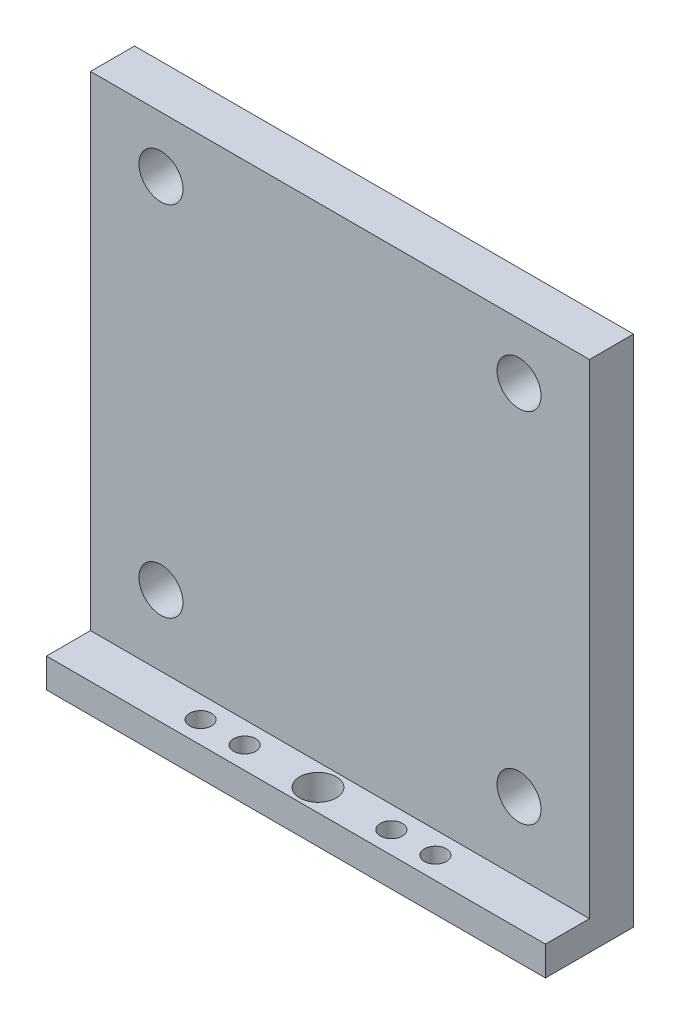
ISO-10303-21;
HEADER;
FILE_DESCRIPTION(('STEP AP214'),'2;1');
FILE_NAME('part.step','',(''),(''),'','','');
FILE_SCHEMA(('AUTOMOTIVE_DESIGN { 1 0 10303 214 1 1 1 1 }'));
ENDSEC;
DATA;
#1=APPLICATION_CONTEXT('core data for automotive mechanical design processes');
#2=APPLICATION_PROTOCOL_DEFINITION('international standard','automotive_design',2000,#1);
#3=PRODUCT_CONTEXT('',#1,'mechanical');
#4=PRODUCT('Part','Part','',(#3));
#5=PRODUCT_RELATED_PRODUCT_CATEGORY('part','',(#4));
#6=PRODUCT_DEFINITION_FORMATION('','',#4);
#7=PRODUCT_DEFINITION_CONTEXT('part definition',#1,'design');
#8=PRODUCT_DEFINITION('design','',#6,#7);
#9=PRODUCT_DEFINITION_SHAPE('','',#8);
#10=(LENGTH_UNIT() NAMED_UNIT(*) SI_UNIT(.MILLI.,.METRE.));
#11=(NAMED_UNIT(*) PLANE_ANGLE_UNIT() SI_UNIT($,.RADIAN.));
#12=(NAMED_UNIT(*) SI_UNIT($,.STERADIAN.) SOLID_ANGLE_UNIT());
#13=UNCERTAINTY_MEASURE_WITH_UNIT(LENGTH_MEASURE(1.E-05),#10,'distance_accuracy_value','');
#14=(GEOMETRIC_REPRESENTATION_CONTEXT(3) GLOBAL_UNCERTAINTY_ASSIGNED_CONTEXT((#13)) GLOBAL_UNIT_ASSIGNED_CONTEXT((#10,
#11,#12)) REPRESENTATION_CONTEXT('',''));
#15=CARTESIAN_POINT('',(0.,0.,0.));
#16=DIRECTION('',(0.,0.,1.));
#17=DIRECTION('',(1.,0.,0.));
#18=AXIS2_PLACEMENT_3D('',#15,#16,#17);
#19=CARTESIAN_POINT('',(34.,2.,0.));
#20=DIRECTION('',(0.,0.,-1.));
#21=DIRECTION('',(-1.,0.,0.));
#22=AXIS2_PLACEMENT_3D('',#19,#20,#21);
#23=PLANE('',#22);
#24=DIRECTION('',(0.,-1.,0.));
#25=VECTOR('',#24,1.);
#26=CARTESIAN_POINT('',(0.,2.,0.));
#27=LINE('',#26,#25);
#28=CARTESIAN_POINT('',(0.,2.,0.));
#29=VERTEX_POINT('',#28);
#30=CARTESIAN_POINT('',(0.,0.,0.));
#31=VERTEX_POINT('',#30);
#32=EDGE_CURVE('E128',#29,#31,#27,.T.);
#33=ORIENTED_EDGE('',*,*,#32,.T.);
#34=DIRECTION('',(-1.,0.,0.));
#35=VECTOR('',#34,1.);
#36=CARTESIAN_POINT('',(34.,0.,0.));
#37=LINE('',#36,#35);
#38=CARTESIAN_POINT('',(34.,0.,0.));
#39=VERTEX_POINT('',#38);
#40=EDGE_CURVE('E11',#39,#31,#37,.T.);
#41=ORIENTED_EDGE('',*,*,#40,.F.);
#42=DIRECTION('',(0.,-1.,0.));
#43=VECTOR('',#42,1.);
#44=CARTESIAN_POINT('',(34.,2.,0.));
#45=LINE('',#44,#43);
#46=CARTESIAN_POINT('',(34.,2.,0.));
#47=VERTEX_POINT('',#46);
#48=EDGE_CURVE('E145',#47,#39,#45,.T.);
#49=ORIENTED_EDGE('',*,*,#48,.F.);
#50=DIRECTION('',(-1.,0.,0.));
#51=VECTOR('',#50,1.);
#52=CARTESIAN_POINT('',(34.,2.,0.));
#53=LINE('',#52,#51);
#54=EDGE_CURVE('E124',#47,#29,#53,.T.);
#55=ORIENTED_EDGE('',*,*,#54,.T.);
#56=EDGE_LOOP('',(#33,#41,#49,#55));
#57=FACE_BOUND('',#56,.T.);
#58=ADVANCED_FACE('F39',(#57),#23,.F.);
#59=CARTESIAN_POINT('',(34.,0.,0.));
#60=DIRECTION('',(0.,1.,0.));
#61=DIRECTION('',(0.,0.,1.));
#62=AXIS2_PLACEMENT_3D('',#59,#60,#61);
#63=PLANE('',#62);
#64=CARTESIAN_POINT('',(9.,0.,-1.5));
#65=DIRECTION('',(0.,1.,0.));
#66=DIRECTION('',(0.,0.,1.));
#67=AXIS2_PLACEMENT_3D('',#64,#65,#66);
#68=CIRCLE('',#67,0.75);
#69=CARTESIAN_POINT('',(9.,0.,-0.75));
#70=VERTEX_POINT('',#69);
#71=EDGE_CURVE('E319',#70,#70,#68,.T.);
#72=ORIENTED_EDGE('',*,*,#71,.T.);
#73=EDGE_LOOP('',(#72));
#74=FACE_BOUND('',#73,.T.);
#75=CARTESIAN_POINT('',(12.,0.,-1.5));
#76=DIRECTION('',(0.,1.,0.));
#77=DIRECTION('',(0.,0.,1.));
#78=AXIS2_PLACEMENT_3D('',#75,#76,#77);
#79=CIRCLE('',#78,0.75);
#80=CARTESIAN_POINT('',(12.,0.,-0.75));
#81=VERTEX_POINT('',#80);
#82=EDGE_CURVE('E388',#81,#81,#79,.T.);
#83=ORIENTED_EDGE('',*,*,#82,.T.);
#84=EDGE_LOOP('',(#83));
#85=FACE_BOUND('',#84,.T.);
#86=CARTESIAN_POINT('',(25.,0.,-1.5));
#87=DIRECTION('',(0.,1.,0.));
#88=DIRECTION('',(0.,0.,1.));
#89=AXIS2_PLACEMENT_3D('',#86,#87,#88);
#90=CIRCLE('',#89,0.750000000000002);
#91=CARTESIAN_POINT('',(25.,0.,-0.749999999999998));
#92=VERTEX_POINT('',#91);
#93=EDGE_CURVE('E380',#92,#92,#90,.T.);
#94=ORIENTED_EDGE('',*,*,#93,.T.);
#95=EDGE_LOOP('',(#94));
#96=FACE_BOUND('',#95,.T.);
#97=CARTESIAN_POINT('',(22.,0.,-1.5));
#98=DIRECTION('',(0.,1.,0.));
#99=DIRECTION('',(0.,0.,1.));
#100=AXIS2_PLACEMENT_3D('',#97,#98,#99);
#101=CIRCLE('',#100,0.750000000000002);
#102=CARTESIAN_POINT('',(22.,0.,-0.749999999999998));
#103=VERTEX_POINT('',#102);
#104=EDGE_CURVE('E338',#103,#103,#101,.T.);
#105=ORIENTED_EDGE('',*,*,#104,.T.);
#106=EDGE_LOOP('',(#105));
#107=FACE_BOUND('',#106,.T.);
#108=CARTESIAN_POINT('',(17.,0.,-1.5));
#109=DIRECTION('',(0.,1.,0.));
#110=DIRECTION('',(0.,0.,1.));
#111=AXIS2_PLACEMENT_3D('',#108,#109,#110);
#112=CIRCLE('',#111,1.25);
#113=CARTESIAN_POINT('',(17.,0.,-0.250000000000002));
#114=VERTEX_POINT('',#113);
#115=EDGE_CURVE('E329',#114,#114,#112,.T.);
#116=ORIENTED_EDGE('',*,*,#115,.T.);
#117=EDGE_LOOP('',(#116));
#118=FACE_BOUND('',#117,.T.);
#119=DIRECTION('',(0.,0.,-1.));
#120=VECTOR('',#119,1.);
#121=CARTESIAN_POINT('',(0.,0.,0.));
#122=LINE('',#121,#120);
#123=CARTESIAN_POINT('',(0.,0.,-6.));
#124=VERTEX_POINT('',#123);
#125=EDGE_CURVE('E132',#31,#124,#122,.T.);
#126=ORIENTED_EDGE('',*,*,#125,.T.);
#127=DIRECTION('',(-1.,0.,0.));
#128=VECTOR('',#127,1.);
#129=CARTESIAN_POINT('',(34.,0.,-6.));
#130=LINE('',#129,#128);
#131=CARTESIAN_POINT('',(34.,0.,-6.));
#132=VERTEX_POINT('',#131);
#133=EDGE_CURVE('E48',#132,#124,#130,.T.);
#134=ORIENTED_EDGE('',*,*,#133,.F.);
#135=DIRECTION('',(0.,0.,-1.));
#136=VECTOR('',#135,1.);
#137=CARTESIAN_POINT('',(34.,0.,0.));
#138=LINE('',#137,#136);
#139=EDGE_CURVE('E93',#39,#132,#138,.T.);
#140=ORIENTED_EDGE('',*,*,#139,.F.);
#141=ORIENTED_EDGE('',*,*,#40,.T.);
#142=EDGE_LOOP('',(#126,#134,#140,#141));
#143=FACE_BOUND('',#142,.T.);
#144=ADVANCED_FACE('F177',(#74,#85,#96,#107,#118,#143),#63,.F.);
#145=CARTESIAN_POINT('',(34.,0.,-6.));
#146=DIRECTION('',(0.,0.,1.));
#147=DIRECTION('',(1.,0.,0.));
#148=AXIS2_PLACEMENT_3D('',#145,#146,#147);
#149=PLANE('',#148);
#150=CARTESIAN_POINT('',(29.2,6.8,-6.));
#151=DIRECTION('',(0.,0.,1.));
#152=DIRECTION('',(1.,0.,0.));
#153=AXIS2_PLACEMENT_3D('',#150,#151,#152);
#154=CIRCLE('',#153,1.5);
#155=CARTESIAN_POINT('',(30.7,6.8,-6.));
#156=VERTEX_POINT('',#155);
#157=EDGE_CURVE('E356',#156,#156,#154,.T.);
#158=ORIENTED_EDGE('',*,*,#157,.T.);
#159=EDGE_LOOP('',(#158));
#160=FACE_BOUND('',#159,.T.);
#161=CARTESIAN_POINT('',(4.8,6.8,-6.));
#162=DIRECTION('',(0.,0.,1.));
#163=DIRECTION('',(1.,0.,0.));
#164=AXIS2_PLACEMENT_3D('',#161,#162,#163);
#165=CIRCLE('',#164,1.5);
#166=CARTESIAN_POINT('',(6.3,6.8,-6.));
#167=VERTEX_POINT('',#166);
#168=EDGE_CURVE('E348',#167,#167,#165,.T.);
#169=ORIENTED_EDGE('',*,*,#168,.T.);
#170=EDGE_LOOP('',(#169));
#171=FACE_BOUND('',#170,.T.);
#172=CARTESIAN_POINT('',(4.8,31.2,-6.));
#173=DIRECTION('',(0.,0.,1.));
#174=DIRECTION('',(1.,0.,0.));
#175=AXIS2_PLACEMENT_3D('',#172,#173,#174);
#176=CIRCLE('',#175,1.5);
#177=CARTESIAN_POINT('',(6.3,31.2,-6.));
#178=VERTEX_POINT('',#177);
#179=EDGE_CURVE('E339',#178,#178,#176,.T.);
#180=ORIENTED_EDGE('',*,*,#179,.T.);
#181=EDGE_LOOP('',(#180));
#182=FACE_BOUND('',#181,.T.);
#183=CARTESIAN_POINT('',(29.2,31.2,-6.));
#184=DIRECTION('',(0.,0.,1.));
#185=DIRECTION('',(1.,0.,0.));
#186=AXIS2_PLACEMENT_3D('',#183,#184,#185);
#187=CIRCLE('',#186,1.5);
#188=CARTESIAN_POINT('',(30.7,31.2,-6.));
#189=VERTEX_POINT('',#188);
#190=EDGE_CURVE('E133',#189,#189,#187,.T.);
#191=ORIENTED_EDGE('',*,*,#190,.T.);
#192=EDGE_LOOP('',(#191));
#193=FACE_BOUND('',#192,.T.);
#194=DIRECTION('',(0.,1.,0.));
#195=VECTOR('',#194,1.);
#196=CARTESIAN_POINT('',(0.,0.,-6.));
#197=LINE('',#196,#195);
#198=CARTESIAN_POINT('',(0.,35.,-6.));
#199=VERTEX_POINT('',#198);
#200=EDGE_CURVE('E136',#124,#199,#197,.T.);
#201=ORIENTED_EDGE('',*,*,#200,.T.);
#202=DIRECTION('',(-1.,0.,0.));
#203=VECTOR('',#202,1.);
#204=CARTESIAN_POINT('',(34.,35.,-6.));
#205=LINE('',#204,#203);
#206=CARTESIAN_POINT('',(34.,35.,-6.));
#207=VERTEX_POINT('',#206);
#208=EDGE_CURVE('E117',#207,#199,#205,.T.);
#209=ORIENTED_EDGE('',*,*,#208,.F.);
#210=DIRECTION('',(0.,1.,0.));
#211=VECTOR('',#210,1.);
#212=CARTESIAN_POINT('',(34.,0.,-6.));
#213=LINE('',#212,#211);
#214=EDGE_CURVE('E106',#132,#207,#213,.T.);
#215=ORIENTED_EDGE('',*,*,#214,.F.);
#216=ORIENTED_EDGE('',*,*,#133,.T.);
#217=EDGE_LOOP('',(#201,#209,#215,#216));
#218=FACE_BOUND('',#217,.T.);
#219=ADVANCED_FACE('F155',(#160,#171,#182,#193,#218),#149,.F.);
#220=CARTESIAN_POINT('',(34.,35.,-6.));
#221=DIRECTION('',(0.,-1.,0.));
#222=DIRECTION('',(0.,0.,-1.));
#223=AXIS2_PLACEMENT_3D('',#220,#221,#222);
#224=PLANE('',#223);
#225=DIRECTION('',(0.,0.,1.));
#226=VECTOR('',#225,1.);
#227=CARTESIAN_POINT('',(0.,35.,-6.));
#228=LINE('',#227,#226);
#229=CARTESIAN_POINT('',(0.,35.,-3.));
#230=VERTEX_POINT('',#229);
#231=EDGE_CURVE('E115',#199,#230,#228,.T.);
#232=ORIENTED_EDGE('',*,*,#231,.T.);
#233=DIRECTION('',(-1.,0.,0.));
#234=VECTOR('',#233,1.);
#235=CARTESIAN_POINT('',(34.,35.,-3.));
#236=LINE('',#235,#234);
#237=CARTESIAN_POINT('',(34.,35.,-3.));
#238=VERTEX_POINT('',#237);
#239=EDGE_CURVE('E112',#238,#230,#236,.T.);
#240=ORIENTED_EDGE('',*,*,#239,.F.);
#241=DIRECTION('',(0.,0.,1.));
#242=VECTOR('',#241,1.);
#243=CARTESIAN_POINT('',(34.,35.,-6.));
#244=LINE('',#243,#242);
#245=EDGE_CURVE('E100',#207,#238,#244,.T.);
#246=ORIENTED_EDGE('',*,*,#245,.F.);
#247=ORIENTED_EDGE('',*,*,#208,.T.);
#248=EDGE_LOOP('',(#232,#240,#246,#247));
#249=FACE_BOUND('',#248,.T.);
#250=ADVANCED_FACE('F113',(#249),#224,.F.);
#251=CARTESIAN_POINT('',(34.,35.,-3.));
#252=DIRECTION('',(0.,0.,-1.));
#253=DIRECTION('',(0.,1.,0.));
#254=AXIS2_PLACEMENT_3D('',#251,#252,#253);
#255=PLANE('',#254);
#256=CARTESIAN_POINT('',(29.2,6.8,-3.));
#257=DIRECTION('',(0.,0.,1.));
#258=DIRECTION('',(1.,0.,0.));
#259=AXIS2_PLACEMENT_3D('',#256,#257,#258);
#260=CIRCLE('',#259,1.5);
#261=CARTESIAN_POINT('',(30.7,6.8,-3.));
#262=VERTEX_POINT('',#261);
#263=EDGE_CURVE('E333',#262,#262,#260,.T.);
#264=ORIENTED_EDGE('',*,*,#263,.F.);
#265=EDGE_LOOP('',(#264));
#266=FACE_BOUND('',#265,.T.);
#267=CARTESIAN_POINT('',(4.8,6.8,-3.));
#268=DIRECTION('',(0.,0.,1.));
#269=DIRECTION('',(1.,0.,0.));
#270=AXIS2_PLACEMENT_3D('',#267,#268,#269);
#271=CIRCLE('',#270,1.5);
#272=CARTESIAN_POINT('',(6.3,6.8,-3.));
#273=VERTEX_POINT('',#272);
#274=EDGE_CURVE('E352',#273,#273,#271,.T.);
#275=ORIENTED_EDGE('',*,*,#274,.F.);
#276=EDGE_LOOP('',(#275));
#277=FACE_BOUND('',#276,.T.);
#278=CARTESIAN_POINT('',(4.8,31.2,-3.));
#279=DIRECTION('',(0.,0.,1.));
#280=DIRECTION('',(1.,0.,0.));
#281=AXIS2_PLACEMENT_3D('',#278,#279,#280);
#282=CIRCLE('',#281,1.5);
#283=CARTESIAN_POINT('',(6.3,31.2,-3.));
#284=VERTEX_POINT('',#283);
#285=EDGE_CURVE('E344',#284,#284,#282,.T.);
#286=ORIENTED_EDGE('',*,*,#285,.F.);
#287=EDGE_LOOP('',(#286));
#288=FACE_BOUND('',#287,.T.);
#289=CARTESIAN_POINT('',(29.2,31.2,-3.));
#290=DIRECTION('',(0.,0.,1.));
#291=DIRECTION('',(1.,0.,0.));
#292=AXIS2_PLACEMENT_3D('',#289,#290,#291);
#293=CIRCLE('',#292,1.5);
#294=CARTESIAN_POINT('',(30.7,31.2,-3.));
#295=VERTEX_POINT('',#294);
#296=EDGE_CURVE('E343',#295,#295,#293,.T.);
#297=ORIENTED_EDGE('',*,*,#296,.F.);
#298=EDGE_LOOP('',(#297));
#299=FACE_BOUND('',#298,.T.);
#300=DIRECTION('',(0.,-1.,0.));
#301=VECTOR('',#300,1.);
#302=CARTESIAN_POINT('',(0.,35.,-3.));
#303=LINE('',#302,#301);
#304=CARTESIAN_POINT('',(0.,2.,-3.));
#305=VERTEX_POINT('',#304);
#306=EDGE_CURVE('E79',#230,#305,#303,.T.);
#307=ORIENTED_EDGE('',*,*,#306,.T.);
#308=DIRECTION('',(-1.,0.,0.));
#309=VECTOR('',#308,1.);
#310=CARTESIAN_POINT('',(34.,2.,-3.));
#311=LINE('',#310,#309);
#312=CARTESIAN_POINT('',(34.,2.,-3.));
#313=VERTEX_POINT('',#312);
#314=EDGE_CURVE('E118',#313,#305,#311,.T.);
#315=ORIENTED_EDGE('',*,*,#314,.F.);
#316=DIRECTION('',(0.,-1.,0.));
#317=VECTOR('',#316,1.);
#318=CARTESIAN_POINT('',(34.,35.,-3.));
#319=LINE('',#318,#317);
#320=EDGE_CURVE('E104',#238,#313,#319,.T.);
#321=ORIENTED_EDGE('',*,*,#320,.F.);
#322=ORIENTED_EDGE('',*,*,#239,.T.);
#323=EDGE_LOOP('',(#307,#315,#321,#322));
#324=FACE_BOUND('',#323,.T.);
#325=ADVANCED_FACE('F120',(#266,#277,#288,#299,#324),#255,.F.);
#326=CARTESIAN_POINT('',(34.,2.,-3.));
#327=DIRECTION('',(0.,-1.,0.));
#328=DIRECTION('',(0.,0.,-1.));
#329=AXIS2_PLACEMENT_3D('',#326,#327,#328);
#330=PLANE('',#329);
#331=CARTESIAN_POINT('',(9.,2.,-1.5));
#332=DIRECTION('',(0.,1.,0.));
#333=DIRECTION('',(0.,0.,1.));
#334=AXIS2_PLACEMENT_3D('',#331,#332,#333);
#335=CIRCLE('',#334,0.75);
#336=CARTESIAN_POINT('',(9.,2.,-0.75));
#337=VERTEX_POINT('',#336);
#338=EDGE_CURVE('E321',#337,#337,#335,.T.);
#339=ORIENTED_EDGE('',*,*,#338,.F.);
#340=EDGE_LOOP('',(#339));
#341=FACE_BOUND('',#340,.T.);
#342=CARTESIAN_POINT('',(12.,2.,-1.5));
#343=DIRECTION('',(0.,1.,0.));
#344=DIRECTION('',(0.,0.,1.));
#345=AXIS2_PLACEMENT_3D('',#342,#343,#344);
#346=CIRCLE('',#345,0.75);
#347=CARTESIAN_POINT('',(12.,2.,-0.75));
#348=VERTEX_POINT('',#347);
#349=EDGE_CURVE('E325',#348,#348,#346,.T.);
#350=ORIENTED_EDGE('',*,*,#349,.F.);
#351=EDGE_LOOP('',(#350));
#352=FACE_BOUND('',#351,.T.);
#353=CARTESIAN_POINT('',(25.,2.,-1.5));
#354=DIRECTION('',(0.,1.,0.));
#355=DIRECTION('',(0.,0.,1.));
#356=AXIS2_PLACEMENT_3D('',#353,#354,#355);
#357=CIRCLE('',#356,0.750000000000002);
#358=CARTESIAN_POINT('',(25.,2.,-0.749999999999998));
#359=VERTEX_POINT('',#358);
#360=EDGE_CURVE('E384',#359,#359,#357,.T.);
#361=ORIENTED_EDGE('',*,*,#360,.F.);
#362=EDGE_LOOP('',(#361));
#363=FACE_BOUND('',#362,.T.);
#364=CARTESIAN_POINT('',(22.,2.,-1.5));
#365=DIRECTION('',(0.,1.,0.));
#366=DIRECTION('',(0.,0.,1.));
#367=AXIS2_PLACEMENT_3D('',#364,#365,#366);
#368=CIRCLE('',#367,0.750000000000002);
#369=CARTESIAN_POINT('',(22.,2.,-0.749999999999998));
#370=VERTEX_POINT('',#369);
#371=EDGE_CURVE('E376',#370,#370,#368,.T.);
#372=ORIENTED_EDGE('',*,*,#371,.F.);
#373=EDGE_LOOP('',(#372));
#374=FACE_BOUND('',#373,.T.);
#375=CARTESIAN_POINT('',(17.,2.,-1.5));
#376=DIRECTION('',(0.,1.,0.));
#377=DIRECTION('',(0.,0.,1.));
#378=AXIS2_PLACEMENT_3D('',#375,#376,#377);
#379=CIRCLE('',#378,1.25);
#380=CARTESIAN_POINT('',(17.,2.,-0.250000000000003));
#381=VERTEX_POINT('',#380);
#382=EDGE_CURVE('E334',#381,#381,#379,.T.);
#383=ORIENTED_EDGE('',*,*,#382,.F.);
#384=EDGE_LOOP('',(#383));
#385=FACE_BOUND('',#384,.T.);
#386=DIRECTION('',(0.,0.,1.));
#387=VECTOR('',#386,1.);
#388=CARTESIAN_POINT('',(0.,2.,-3.));
#389=LINE('',#388,#387);
#390=EDGE_CURVE('E85',#305,#29,#389,.T.);
#391=ORIENTED_EDGE('',*,*,#390,.T.);
#392=ORIENTED_EDGE('',*,*,#54,.F.);
#393=DIRECTION('',(0.,0.,1.));
#394=VECTOR('',#393,1.);
#395=CARTESIAN_POINT('',(34.,2.,-3.));
#396=LINE('',#395,#394);
#397=EDGE_CURVE('E56',#313,#47,#396,.T.);
#398=ORIENTED_EDGE('',*,*,#397,.F.);
#399=ORIENTED_EDGE('',*,*,#314,.T.);
#400=EDGE_LOOP('',(#391,#392,#398,#399));
#401=FACE_BOUND('',#400,.T.);
#402=ADVANCED_FACE('F162',(#341,#352,#363,#374,#385,#401),#330,.F.);
#403=CARTESIAN_POINT('',(34.,0.,0.));
#404=DIRECTION('',(1.,0.,0.));
#405=DIRECTION('',(0.,0.,-1.));
#406=AXIS2_PLACEMENT_3D('',#403,#404,#405);
#407=PLANE('',#406);
#408=ORIENTED_EDGE('',*,*,#48,.T.);
#409=ORIENTED_EDGE('',*,*,#139,.T.);
#410=ORIENTED_EDGE('',*,*,#214,.T.);
#411=ORIENTED_EDGE('',*,*,#245,.T.);
#412=ORIENTED_EDGE('',*,*,#320,.T.);
#413=ORIENTED_EDGE('',*,*,#397,.T.);
#414=EDGE_LOOP('',(#408,#409,#410,#411,#412,#413));
#415=FACE_BOUND('',#414,.T.);
#416=ADVANCED_FACE('F102',(#415),#407,.T.);
#417=CARTESIAN_POINT('',(0.,0.,0.));
#418=DIRECTION('',(1.,0.,0.));
#419=DIRECTION('',(0.,0.,-1.));
#420=AXIS2_PLACEMENT_3D('',#417,#418,#419);
#421=PLANE('',#420);
#422=ORIENTED_EDGE('',*,*,#32,.F.);
#423=ORIENTED_EDGE('',*,*,#390,.F.);
#424=ORIENTED_EDGE('',*,*,#306,.F.);
#425=ORIENTED_EDGE('',*,*,#231,.F.);
#426=ORIENTED_EDGE('',*,*,#200,.F.);
#427=ORIENTED_EDGE('',*,*,#125,.F.);
#428=EDGE_LOOP('',(#422,#423,#424,#425,#426,#427));
#429=FACE_BOUND('',#428,.T.);
#430=ADVANCED_FACE('F158',(#429),#421,.F.);
#431=CARTESIAN_POINT('',(29.2,31.2,-6.));
#432=DIRECTION('',(0.,0.,1.));
#433=DIRECTION('',(1.,0.,0.));
#434=AXIS2_PLACEMENT_3D('',#431,#432,#433);
#435=CYLINDRICAL_SURFACE('',#434,1.5);
#436=ORIENTED_EDGE('',*,*,#190,.F.);
#437=EDGE_LOOP('',(#436));
#438=FACE_BOUND('',#437,.T.);
#439=ORIENTED_EDGE('',*,*,#296,.T.);
#440=EDGE_LOOP('',(#439));
#441=FACE_BOUND('',#440,.T.);
#442=ADVANCED_FACE('F209',(#438,#441),#435,.F.);
#443=CARTESIAN_POINT('',(4.8,31.2,-6.));
#444=DIRECTION('',(0.,0.,1.));
#445=DIRECTION('',(1.,0.,0.));
#446=AXIS2_PLACEMENT_3D('',#443,#444,#445);
#447=CYLINDRICAL_SURFACE('',#446,1.5);
#448=ORIENTED_EDGE('',*,*,#179,.F.);
#449=EDGE_LOOP('',(#448));
#450=FACE_BOUND('',#449,.T.);
#451=ORIENTED_EDGE('',*,*,#285,.T.);
#452=EDGE_LOOP('',(#451));
#453=FACE_BOUND('',#452,.T.);
#454=ADVANCED_FACE('F214',(#450,#453),#447,.F.);
#455=CARTESIAN_POINT('',(4.8,6.8,-6.));
#456=DIRECTION('',(0.,0.,1.));
#457=DIRECTION('',(1.,0.,0.));
#458=AXIS2_PLACEMENT_3D('',#455,#456,#457);
#459=CYLINDRICAL_SURFACE('',#458,1.5);
#460=ORIENTED_EDGE('',*,*,#168,.F.);
#461=EDGE_LOOP('',(#460));
#462=FACE_BOUND('',#461,.T.);
#463=ORIENTED_EDGE('',*,*,#274,.T.);
#464=EDGE_LOOP('',(#463));
#465=FACE_BOUND('',#464,.T.);
#466=ADVANCED_FACE('F226',(#462,#465),#459,.F.);
#467=CARTESIAN_POINT('',(29.2,6.8,-6.));
#468=DIRECTION('',(0.,0.,1.));
#469=DIRECTION('',(1.,0.,0.));
#470=AXIS2_PLACEMENT_3D('',#467,#468,#469);
#471=CYLINDRICAL_SURFACE('',#470,1.5);
#472=ORIENTED_EDGE('',*,*,#157,.F.);
#473=EDGE_LOOP('',(#472));
#474=FACE_BOUND('',#473,.T.);
#475=ORIENTED_EDGE('',*,*,#263,.T.);
#476=EDGE_LOOP('',(#475));
#477=FACE_BOUND('',#476,.T.);
#478=ADVANCED_FACE('F236',(#474,#477),#471,.F.);
#479=CARTESIAN_POINT('',(17.,0.,-1.5));
#480=DIRECTION('',(0.,1.,0.));
#481=DIRECTION('',(0.,0.,1.));
#482=AXIS2_PLACEMENT_3D('',#479,#480,#481);
#483=CYLINDRICAL_SURFACE('',#482,1.25);
#484=ORIENTED_EDGE('',*,*,#115,.F.);
#485=EDGE_LOOP('',(#484));
#486=FACE_BOUND('',#485,.T.);
#487=ORIENTED_EDGE('',*,*,#382,.T.);
#488=EDGE_LOOP('',(#487));
#489=FACE_BOUND('',#488,.T.);
#490=ADVANCED_FACE('F245',(#486,#489),#483,.F.);
#491=CARTESIAN_POINT('',(22.,0.,-1.5));
#492=DIRECTION('',(0.,1.,0.));
#493=DIRECTION('',(0.,0.,1.));
#494=AXIS2_PLACEMENT_3D('',#491,#492,#493);
#495=CYLINDRICAL_SURFACE('',#494,0.750000000000002);
#496=ORIENTED_EDGE('',*,*,#104,.F.);
#497=EDGE_LOOP('',(#496));
#498=FACE_BOUND('',#497,.T.);
#499=ORIENTED_EDGE('',*,*,#371,.T.);
#500=EDGE_LOOP('',(#499));
#501=FACE_BOUND('',#500,.T.);
#502=ADVANCED_FACE('F265',(#498,#501),#495,.F.);
#503=CARTESIAN_POINT('',(25.,0.,-1.5));
#504=DIRECTION('',(0.,1.,0.));
#505=DIRECTION('',(0.,0.,1.));
#506=AXIS2_PLACEMENT_3D('',#503,#504,#505);
#507=CYLINDRICAL_SURFACE('',#506,0.750000000000002);
#508=ORIENTED_EDGE('',*,*,#93,.F.);
#509=EDGE_LOOP('',(#508));
#510=FACE_BOUND('',#509,.T.);
#511=ORIENTED_EDGE('',*,*,#360,.T.);
#512=EDGE_LOOP('',(#511));
#513=FACE_BOUND('',#512,.T.);
#514=ADVANCED_FACE('F275',(#510,#513),#507,.F.);
#515=CARTESIAN_POINT('',(12.,0.,-1.5));
#516=DIRECTION('',(0.,1.,0.));
#517=DIRECTION('',(0.,0.,1.));
#518=AXIS2_PLACEMENT_3D('',#515,#516,#517);
#519=CYLINDRICAL_SURFACE('',#518,0.75);
#520=ORIENTED_EDGE('',*,*,#82,.F.);
#521=EDGE_LOOP('',(#520));
#522=FACE_BOUND('',#521,.T.);
#523=ORIENTED_EDGE('',*,*,#349,.T.);
#524=EDGE_LOOP('',(#523));
#525=FACE_BOUND('',#524,.T.);
#526=ADVANCED_FACE('F285',(#522,#525),#519,.F.);
#527=CARTESIAN_POINT('',(9.,0.,-1.5));
#528=DIRECTION('',(0.,1.,0.));
#529=DIRECTION('',(0.,0.,1.));
#530=AXIS2_PLACEMENT_3D('',#527,#528,#529);
#531=CYLINDRICAL_SURFACE('',#530,0.75);
#532=ORIENTED_EDGE('',*,*,#71,.F.);
#533=EDGE_LOOP('',(#532));
#534=FACE_BOUND('',#533,.T.);
#535=ORIENTED_EDGE('',*,*,#338,.T.);
#536=EDGE_LOOP('',(#535));
#537=FACE_BOUND('',#536,.T.);
#538=ADVANCED_FACE('F295',(#534,#537),#531,.F.);
#539=CLOSED_SHELL('',(#58,#144,#219,#250,#325,#402,#416,#430,#442,#454,#466,#478,#490,#502,#514,
#526,#538));
#540=MANIFOLD_SOLID_BREP('B2',#539);
#541=ADVANCED_BREP_SHAPE_REPRESENTATION('',(#18,#540),#14);
#542=SHAPE_DEFINITION_REPRESENTATION(#9,#541);
ENDSEC;
END-ISO-10303-21;
